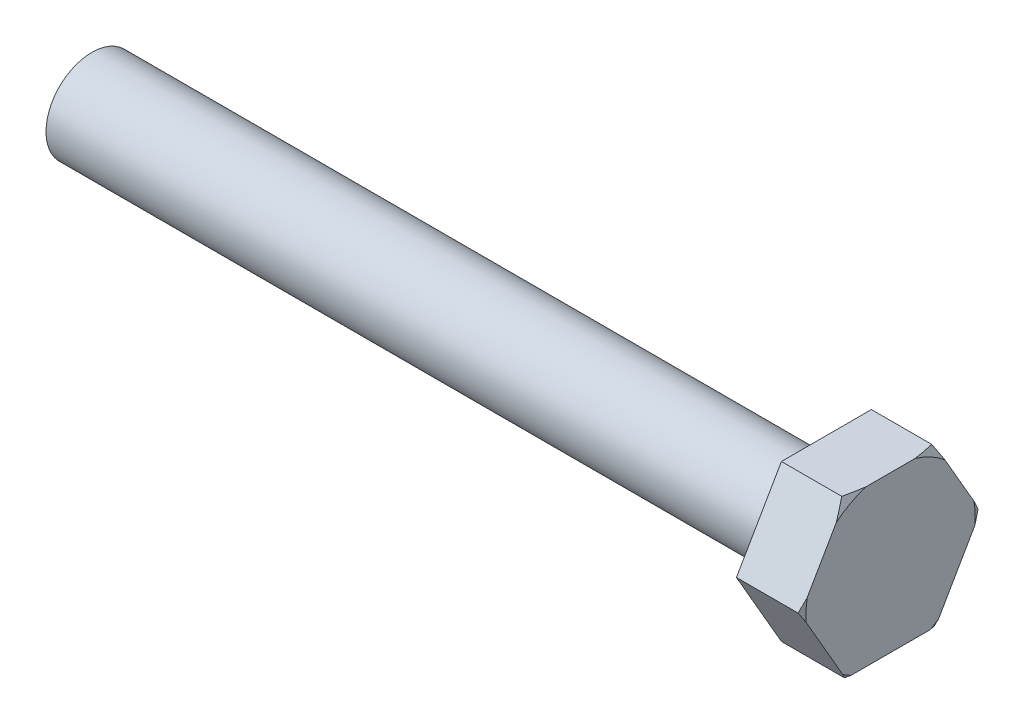
ISO-10303-21;
HEADER;
FILE_DESCRIPTION(('STEP AP214'),'2;1');
FILE_NAME('part.step','',(''),(''),'','','');
FILE_SCHEMA(('AUTOMOTIVE_DESIGN { 1 0 10303 214 1 1 1 1 }'));
ENDSEC;
DATA;
#1=APPLICATION_CONTEXT('core data for automotive mechanical design processes');
#2=APPLICATION_PROTOCOL_DEFINITION('international standard','automotive_design',2000,#1);
#3=PRODUCT_CONTEXT('',#1,'mechanical');
#4=PRODUCT('Part','Part','',(#3));
#5=PRODUCT_RELATED_PRODUCT_CATEGORY('part','',(#4));
#6=PRODUCT_DEFINITION_FORMATION('','',#4);
#7=PRODUCT_DEFINITION_CONTEXT('part definition',#1,'design');
#8=PRODUCT_DEFINITION('design','',#6,#7);
#9=PRODUCT_DEFINITION_SHAPE('','',#8);
#10=(LENGTH_UNIT() NAMED_UNIT(*) SI_UNIT(.MILLI.,.METRE.));
#11=(NAMED_UNIT(*) PLANE_ANGLE_UNIT() SI_UNIT($,.RADIAN.));
#12=(NAMED_UNIT(*) SI_UNIT($,.STERADIAN.) SOLID_ANGLE_UNIT());
#13=UNCERTAINTY_MEASURE_WITH_UNIT(LENGTH_MEASURE(1.E-05),#10,'distance_accuracy_value','');
#14=(GEOMETRIC_REPRESENTATION_CONTEXT(3) GLOBAL_UNCERTAINTY_ASSIGNED_CONTEXT((#13)) GLOBAL_UNIT_ASSIGNED_CONTEXT((#10,
#11,#12)) REPRESENTATION_CONTEXT('',''));
#15=CARTESIAN_POINT('',(0.,0.,0.));
#16=DIRECTION('',(0.,0.,1.));
#17=DIRECTION('',(1.,0.,0.));
#18=AXIS2_PLACEMENT_3D('',#15,#16,#17);
#19=CARTESIAN_POINT('',(-14.,-16.3225537589597,-9.81495457622384));
#20=DIRECTION('',(0.,-0.499999999999995,-0.866025403784441));
#21=DIRECTION('',(0.,0.866025403784442,-0.499999999999995));
#22=AXIS2_PLACEMENT_3D('',#19,#20,#21);
#23=PLANE('',#22);
#24=DIRECTION('',(1.,0.,0.));
#25=VECTOR('',#24,1.);
#26=CARTESIAN_POINT('',(-14.,0.677446241040188,-19.6299091524473));
#27=LINE('',#26,#25);
#28=CARTESIAN_POINT('',(-14.,0.677446241040188,-19.6299091524473));
#29=VERTEX_POINT('',#28);
#30=CARTESIAN_POINT('',(-0.56404183558314,0.677446241040188,-19.6299091524473));
#31=VERTEX_POINT('',#30);
#32=EDGE_CURVE('E193',#29,#31,#27,.T.);
#33=ORIENTED_EDGE('',*,*,#32,.T.);
#34=CARTESIAN_POINT('',(-0.564246750765332,0.678146241040188,-19.6303132976357));
#35=CARTESIAN_POINT('',(-0.415814321341136,0.17101445189822,-19.33752062266));
#36=CARTESIAN_POINT('',(-0.275773962525172,-0.338062329478098,-19.0436050058942));
#37=CARTESIAN_POINT('',(-0.0156550779420489,-1.36032284996286,-18.4534026192104));
#38=CARTESIAN_POINT('',(0.104411729980572,-1.87350881607,-18.1571145635341));
#39=CARTESIAN_POINT('',(0.321414317607774,-2.90451266562627,-17.5618642134573));
#40=CARTESIAN_POINT('',(0.418309259915875,-3.42233708214182,-17.2628981471891));
#41=CARTESIAN_POINT('',(0.585401824347843,-4.46113953827241,-16.6631452695072));
#42=CARTESIAN_POINT('',(0.655604664031238,-4.98211694131892,-16.3623588256166));
#43=CARTESIAN_POINT('',(0.765297727743773,-6.01450925483577,-15.7663068454984));
#44=CARTESIAN_POINT('',(0.805453354787763,-6.52587051214188,-15.4710722859395));
#45=CARTESIAN_POINT('',(0.855957657962772,-7.5497403179821,-14.8799407779226));
#46=CARTESIAN_POINT('',(0.866304709839916,-8.06224892751211,-14.5840437942484));
#47=CARTESIAN_POINT('',(0.856733594120152,-9.08641961317971,-13.9927385731821));
#48=CARTESIAN_POINT('',(0.836852552812062,-9.59808195632958,-13.6973301816303));
#49=CARTESIAN_POINT('',(0.767766869545671,-10.6198554648516,-13.1074089714344));
#50=CARTESIAN_POINT('',(0.718565204176141,-11.1299667823989,-12.8128960649318));
#51=CARTESIAN_POINT('',(0.607253631978668,-12.0311570853465,-12.2925936009338));
#52=CARTESIAN_POINT('',(0.550674528086197,-12.4227610787008,-12.066500929955));
#53=CARTESIAN_POINT('',(0.422528757833308,-13.2041375377619,-11.6153730209777));
#54=CARTESIAN_POINT('',(0.350961477348241,-13.5939099277514,-11.3903378266945));
#55=CARTESIAN_POINT('',(0.193496282128409,-14.3749707842107,-10.9393921309643));
#56=CARTESIAN_POINT('',(0.107472080145937,-14.7662399890765,-10.7134927502095));
#57=CARTESIAN_POINT('',(-0.0769549646356311,-15.5464689706405,-10.2630273376739));
#58=CARTESIAN_POINT('',(-0.175354127250165,-15.9354293980804,-10.0384609301874));
#59=CARTESIAN_POINT('',(-0.279226674625965,-16.3232537589597,-9.81455043103541));
#60=B_SPLINE_CURVE_WITH_KNOTS('',3,(#34,#35,#36,#37,#38,#39,#40,#41,#42,#43,#44,#45,#46,#47,#48,
#49,#50,#51,#52,#53,#54,#55,#56,#57,#58,#59),.UNSPECIFIED.,.F.,.F.,(4,2,2,2,2,2,2,2,2,2,2,2,4),
(0.,1.81242406030555,3.62590769047617,5.44256417720559,7.25886537561351,9.03364598192863,
10.808523293294,12.5812224520775,14.3537416795701,15.7206225639899,17.0875594658665,
18.4671250183966,19.8462812683619),.UNSPECIFIED.);
#61=CARTESIAN_POINT('',(0.,-1.44061645681595,-18.4070450836796));
#62=VERTEX_POINT('',#61);
#63=EDGE_CURVE('E212',#31,#62,#60,.T.);
#64=ORIENTED_EDGE('',*,*,#63,.T.);
#65=DIRECTION('',(0.,0.866025403784441,-0.499999999999995));
#66=VECTOR('',#65,1.);
#67=CARTESIAN_POINT('',(0.,-16.3225537589597,-9.81495457622384));
#68=LINE('',#67,#66);
#69=CARTESIAN_POINT('',(0.,-15.2206604226639,-10.4511329905525));
#70=VERTEX_POINT('',#69);
#71=EDGE_CURVE('E200',#70,#62,#68,.T.);
#72=ORIENTED_EDGE('',*,*,#71,.F.);
#73=CARTESIAN_POINT('',(-0.279039191335554,-16.3225537589597,-9.81495457622384));
#74=VERTEX_POINT('',#73);
#75=EDGE_CURVE('E201',#70,#74,#60,.T.);
#76=ORIENTED_EDGE('',*,*,#75,.T.);
#77=DIRECTION('',(1.,0.,0.));
#78=VECTOR('',#77,1.);
#79=CARTESIAN_POINT('',(-14.,-16.3225537589597,-9.81495457622384));
#80=LINE('',#79,#78);
#81=CARTESIAN_POINT('',(-14.,-16.3225537589597,-9.81495457622384));
#82=VERTEX_POINT('',#81);
#83=EDGE_CURVE('E174',#82,#74,#80,.T.);
#84=ORIENTED_EDGE('',*,*,#83,.F.);
#85=DIRECTION('',(0.,0.866025403784441,-0.499999999999995));
#86=VECTOR('',#85,1.);
#87=CARTESIAN_POINT('',(-14.,-16.3225537589597,-9.81495457622384));
#88=LINE('',#87,#86);
#89=EDGE_CURVE('E173',#82,#29,#88,.T.);
#90=ORIENTED_EDGE('',*,*,#89,.T.);
#91=EDGE_LOOP('',(#33,#64,#72,#76,#84,#90));
#92=FACE_BOUND('',#91,.T.);
#93=ADVANCED_FACE('F44',(#92),#23,.T.);
#94=CARTESIAN_POINT('',(-14.,-16.3225537589599,9.81495457622349));
#95=DIRECTION('',(0.,-1.,0.));
#96=DIRECTION('',(0.,0.,-1.));
#97=AXIS2_PLACEMENT_3D('',#94,#95,#96);
#98=PLANE('',#97);
#99=ORIENTED_EDGE('',*,*,#83,.T.);
#100=CARTESIAN_POINT('',(-0.279211877709635,-16.3225537589597,-9.81565457622384));
#101=CARTESIAN_POINT('',(-0.140002673700859,-16.3225537589597,-9.25130185368696));
#102=CARTESIAN_POINT('',(-0.00904340540102734,-16.3225537589597,-8.68480192183458));
#103=CARTESIAN_POINT('',(0.233399972988422,-16.3225537589597,-7.54733707992563));
#104=CARTESIAN_POINT('',(0.344873191400299,-16.3225537589597,-6.97636985797091));
#105=CARTESIAN_POINT('',(0.545348453218955,-16.3225537589598,-5.82962147136888));
#106=CARTESIAN_POINT('',(0.634318601582534,-16.3225537589598,-5.25383465573977));
#107=CARTESIAN_POINT('',(0.786577898185986,-16.3225537589598,-4.0989481777943));
#108=CARTESIAN_POINT('',(0.849871874587151,-16.3225537589598,-3.5198491590948));
#109=CARTESIAN_POINT('',(0.947232062083349,-16.3225537589598,-2.37231238686003));
#110=CARTESIAN_POINT('',(0.981924651598784,-16.3225537589598,-1.80392838909855));
#111=CARTESIAN_POINT('',(1.02301796483673,-16.3225537589598,-0.66609397049382));
#112=CARTESIAN_POINT('',(1.02941720895588,-16.3225537589598,-0.0966434954368893));
#113=CARTESIAN_POINT('',(1.01365346731486,-16.3225537589598,1.04123426371526));
#114=CARTESIAN_POINT('',(0.991521603235917,-16.3225537589598,1.60966198655161));
#115=CARTESIAN_POINT('',(0.919684407892073,-16.3225537589598,2.74470537933874));
#116=CARTESIAN_POINT('',(0.869981426671911,-16.3225537589599,3.31132119958903));
#117=CARTESIAN_POINT('',(0.752399366199303,-16.3225537589599,4.37439006487519));
#118=CARTESIAN_POINT('',(0.687388306509743,-16.3225537589599,4.87116600248938));
#119=CARTESIAN_POINT('',(0.539237885822729,-16.3225537589599,5.86203065708808));
#120=CARTESIAN_POINT('',(0.456097138531188,-16.3225537589599,6.35611916561438));
#121=CARTESIAN_POINT('',(0.272682697438974,-16.3225537589599,7.34642028960224));
#122=CARTESIAN_POINT('',(0.172238960121658,-16.3225537589599,7.84260110182944));
#123=CARTESIAN_POINT('',(-0.0431254972765272,-16.3225537589599,8.83160737303501));
#124=CARTESIAN_POINT('',(-0.158040260747637,-16.3225537589599,9.32443412514307));
#125=CARTESIAN_POINT('',(-0.279211877709632,-16.3225537589599,9.81565457622349));
#126=B_SPLINE_CURVE_WITH_KNOTS('',3,(#100,#101,#102,#103,#104,#105,#106,#107,#108,#109,#110,
#111,#112,#113,#114,#115,#116,#117,#118,#119,#120,#121,#122,#123,#124,#125),.UNSPECIFIED.,.F.,
.F.,(4,2,2,2,2,2,2,2,2,2,2,2,4),(0.,1.74390678288041,3.48878522266275,5.23612310377648,
6.98313226205368,8.69078097629871,10.39851899115,12.1043957837092,13.8101271969245,
15.3128072238657,16.8156021941761,18.3341095134601,19.8519938106323),.UNSPECIFIED.);
#127=CARTESIAN_POINT('',(0.,-16.3225537589597,-8.62953783664749));
#128=VERTEX_POINT('',#127);
#129=EDGE_CURVE('E210',#74,#128,#126,.T.);
#130=ORIENTED_EDGE('',*,*,#129,.T.);
#131=DIRECTION('',(0.,0.,-1.));
#132=VECTOR('',#131,1.);
#133=CARTESIAN_POINT('',(0.,-16.3225537589599,9.81495457622349));
#134=LINE('',#133,#132);
#135=CARTESIAN_POINT('',(0.,-16.3225537589599,8.62953783664714));
#136=VERTEX_POINT('',#135);
#137=EDGE_CURVE('E164',#136,#128,#134,.T.);
#138=ORIENTED_EDGE('',*,*,#137,.F.);
#139=CARTESIAN_POINT('',(-0.279039191335551,-16.3225537589599,9.81495457622349));
#140=VERTEX_POINT('',#139);
#141=EDGE_CURVE('E61',#136,#140,#126,.T.);
#142=ORIENTED_EDGE('',*,*,#141,.T.);
#143=DIRECTION('',(1.,0.,0.));
#144=VECTOR('',#143,1.);
#145=CARTESIAN_POINT('',(-14.,-16.3225537589599,9.81495457622349));
#146=LINE('',#145,#144);
#147=CARTESIAN_POINT('',(-14.,-16.3225537589599,9.81495457622349));
#148=VERTEX_POINT('',#147);
#149=EDGE_CURVE('E179',#148,#140,#146,.T.);
#150=ORIENTED_EDGE('',*,*,#149,.F.);
#151=DIRECTION('',(0.,0.,-1.));
#152=VECTOR('',#151,1.);
#153=CARTESIAN_POINT('',(-14.,-16.3225537589599,9.81495457622349));
#154=LINE('',#153,#152);
#155=EDGE_CURVE('E196',#148,#82,#154,.T.);
#156=ORIENTED_EDGE('',*,*,#155,.T.);
#157=EDGE_LOOP('',(#99,#130,#138,#142,#150,#156));
#158=FACE_BOUND('',#157,.T.);
#159=ADVANCED_FACE('F287',(#158),#98,.T.);
#160=CARTESIAN_POINT('',(-14.,0.677446241040051,19.6299091524473));
#161=DIRECTION('',(0.,-0.500000000000007,0.866025403784434));
#162=DIRECTION('',(0.,-0.866025403784435,-0.500000000000007));
#163=AXIS2_PLACEMENT_3D('',#160,#161,#162);
#164=PLANE('',#163);
#165=ORIENTED_EDGE('',*,*,#149,.T.);
#166=CARTESIAN_POINT('',(-0.27922667462596,-16.3232537589599,9.81455043103505));
#167=CARTESIAN_POINT('',(-0.149725219641444,-15.8397595856021,10.0936959221748));
#168=CARTESIAN_POINT('',(-0.0287306393909909,-15.3544646092627,10.3738811074007));
#169=CARTESIAN_POINT('',(0.193487404824988,-14.380252646897,10.9363426461203));
#170=CARTESIAN_POINT('',(0.294700925707737,-13.8913339668895,11.2186199776345));
#171=CARTESIAN_POINT('',(0.474537848944333,-12.9099363426834,11.785230160152));
#172=CARTESIAN_POINT('',(0.553142617071182,-12.4174548026946,12.0695645098355));
#173=CARTESIAN_POINT('',(0.685027604467599,-11.4300148625988,12.6396632250584));
#174=CARTESIAN_POINT('',(0.738312227776485,-10.9350569083704,12.9254273331697));
#175=CARTESIAN_POINT('',(0.816730856158126,-9.95394196041103,13.49187431248));
#176=CARTESIAN_POINT('',(0.842434859028281,-9.46781950658883,13.7725372420534));
#177=CARTESIAN_POINT('',(0.866661800786284,-8.49503379124964,14.3341753366683));
#178=CARTESIAN_POINT('',(0.86518329219021,-8.00837050231272,14.6151505175407));
#179=CARTESIAN_POINT('',(0.835114003228707,-7.03609828281367,15.1764921451941));
#180=CARTESIAN_POINT('',(0.806546432151513,-6.55048880631568,15.4568589071712));
#181=CARTESIAN_POINT('',(0.723446957006737,-5.58099311973631,16.016597502796));
#182=CARTESIAN_POINT('',(0.668916993524128,-5.0971067835801,16.295969409233));
#183=CARTESIAN_POINT('',(0.541184608218332,-4.17055176843992,16.8309161966432));
#184=CARTESIAN_POINT('',(0.46983005215454,-3.72768927301,17.0866029775937));
#185=CARTESIAN_POINT('',(0.308712980849957,-2.84448331933253,17.5965221726992));
#186=CARTESIAN_POINT('',(0.218949836004044,-2.40413994777294,17.850754536805));
#187=CARTESIAN_POINT('',(0.0220774663271806,-1.5217109604841,18.360225150157));
#188=CARTESIAN_POINT('',(-0.0852002352457143,-1.07965380210706,18.6154469695432));
#189=CARTESIAN_POINT('',(-0.314317642672809,-0.1985397374262,19.1241584119735));
#190=CARTESIAN_POINT('',(-0.436152022915879,0.240518204379259,19.3776486328647));
#191=CARTESIAN_POINT('',(-0.564246750765328,0.67814624104005,19.6303132976357));
#192=B_SPLINE_CURVE_WITH_KNOTS('',3,(#166,#167,#168,#169,#170,#171,#172,#173,#174,#175,#176,
#177,#178,#179,#180,#181,#182,#183,#184,#185,#186,#187,#188,#189,#190,#191),.UNSPECIFIED.,.F.,
.F.,(4,2,2,2,2,2,2,2,2,2,2,2,4),(0.,1.71942964795087,3.43972136838168,5.16142692376842,
6.88283290595116,8.56793432796852,10.2531254828379,11.9368741078485,13.6204968991383,
15.1691179690331,16.7177920132448,18.2823509694753,19.8463392691165),.UNSPECIFIED.);
#193=CARTESIAN_POINT('',(0.,-15.2206604226641,10.4511329905521));
#194=VERTEX_POINT('',#193);
#195=EDGE_CURVE('E277',#140,#194,#192,.T.);
#196=ORIENTED_EDGE('',*,*,#195,.T.);
#197=DIRECTION('',(0.,-0.866025403784434,-0.500000000000007));
#198=VECTOR('',#197,1.);
#199=CARTESIAN_POINT('',(0.,0.677446241040051,19.6299091524473));
#200=LINE('',#199,#198);
#201=CARTESIAN_POINT('',(0.,-1.44061645681603,18.4070450836795));
#202=VERTEX_POINT('',#201);
#203=EDGE_CURVE('E158',#202,#194,#200,.T.);
#204=ORIENTED_EDGE('',*,*,#203,.F.);
#205=CARTESIAN_POINT('',(-0.564041835583136,0.67744624104005,19.6299091524473));
#206=VERTEX_POINT('',#205);
#207=EDGE_CURVE('E69',#202,#206,#192,.T.);
#208=ORIENTED_EDGE('',*,*,#207,.T.);
#209=DIRECTION('',(1.,0.,0.));
#210=VECTOR('',#209,1.);
#211=CARTESIAN_POINT('',(-14.,0.677446241040051,19.6299091524473));
#212=LINE('',#211,#210);
#213=CARTESIAN_POINT('',(-14.,0.677446241040051,19.6299091524473));
#214=VERTEX_POINT('',#213);
#215=EDGE_CURVE('E149',#214,#206,#212,.T.);
#216=ORIENTED_EDGE('',*,*,#215,.F.);
#217=DIRECTION('',(0.,-0.866025403784434,-0.500000000000007));
#218=VECTOR('',#217,1.);
#219=CARTESIAN_POINT('',(-14.,0.677446241040051,19.6299091524473));
#220=LINE('',#219,#218);
#221=EDGE_CURVE('E330',#214,#148,#220,.T.);
#222=ORIENTED_EDGE('',*,*,#221,.T.);
#223=EDGE_LOOP('',(#165,#196,#204,#208,#216,#222));
#224=FACE_BOUND('',#223,.T.);
#225=ADVANCED_FACE('F284',(#224),#164,.T.);
#226=CARTESIAN_POINT('',(-14.,17.6774462410402,9.81495457622372));
#227=DIRECTION('',(0.,0.499999999999995,0.866025403784441));
#228=DIRECTION('',(0.,-0.866025403784442,0.499999999999995));
#229=AXIS2_PLACEMENT_3D('',#226,#227,#228);
#230=PLANE('',#229);
#231=ORIENTED_EDGE('',*,*,#215,.T.);
#232=CARTESIAN_POINT('',(-0.564223636148396,0.676746241040051,19.6303132976357));
#233=CARTESIAN_POINT('',(-0.435231949450683,1.17335723055571,19.3435948091563));
#234=CARTESIAN_POINT('',(-0.315146944354757,1.67179556332786,19.0558213035559));
#235=CARTESIAN_POINT('',(-0.0955310527984705,2.6722887027642,18.47818632018));
#236=CARTESIAN_POINT('',(0.0039900221717416,3.17434511801504,18.1883239136865));
#237=CARTESIAN_POINT('',(0.179662265277993,4.18186741859714,17.6066306422309));
#238=CARTESIAN_POINT('',(0.255799265206282,4.68733518205602,17.3147986929313));
#239=CARTESIAN_POINT('',(0.382092416355361,5.70063869153272,16.7297676389641));
#240=CARTESIAN_POINT('',(0.43225292996734,6.20847402548685,16.4365687722017));
#241=CARTESIAN_POINT('',(0.50401315648473,7.21540008799938,15.855219738956));
#242=CARTESIAN_POINT('',(0.52616799214128,7.71446083268068,15.5670868836723));
#243=CARTESIAN_POINT('',(0.542908027424486,8.71296203240184,14.9906019472271));
#244=CARTESIAN_POINT('',(0.537491686428164,9.21240250710114,14.7022498547153));
#245=CARTESIAN_POINT('',(0.499312513482771,10.210100860343,14.1262284419011));
#246=CARTESIAN_POINT('',(0.466570850313454,10.7083593550024,13.8385587658834));
#247=CARTESIAN_POINT('',(0.375000683312631,11.70301903785,13.2642917302394));
#248=CARTESIAN_POINT('',(0.316174247350844,12.1994203701194,12.9776942874275));
#249=CARTESIAN_POINT('',(0.185520477880032,13.1123497647944,12.4506142556608));
#250=CARTESIAN_POINT('',(0.117153755437129,13.5292555509076,12.2099135878217));
#251=CARTESIAN_POINT('',(-0.0352278248956144,14.3608944781135,11.7297666293308));
#252=CARTESIAN_POINT('',(-0.119242179156803,14.7756276886904,11.4903202985623));
#253=CARTESIAN_POINT('',(-0.302149939403626,15.6064667132415,11.0106351640845));
#254=CARTESIAN_POINT('',(-0.401170166703252,16.0225514169485,10.7704085483935));
#255=CARTESIAN_POINT('',(-0.611897206829773,16.8522134990667,10.2914029219462));
#256=CARTESIAN_POINT('',(-0.723601193671467,17.2657914144522,10.0526236011675));
#257=CARTESIAN_POINT('',(-0.840855292969141,17.6781462410402,9.81455043103529));
#258=B_SPLINE_CURVE_WITH_KNOTS('',3,(#232,#233,#234,#235,#236,#237,#238,#239,#240,#241,#242,
#243,#244,#245,#246,#247,#248,#249,#250,#251,#252,#253,#254,#255,#256,#257),.UNSPECIFIED.,.F.,
.F.,(4,2,2,2,2,2,2,2,2,2,2,2,4),(0.,1.76338250734104,3.52760442923156,5.29289317867205,
7.05788537609599,8.78731371801048,10.5168386980309,12.2450250667529,13.9730744580296,
15.4315001488114,16.8898789073749,18.3613519853359,19.8324978549745),.UNSPECIFIED.);
#259=CARTESIAN_POINT('',(0.,3.17413419656951,18.1884456892399));
#260=VERTEX_POINT('',#259);
#261=EDGE_CURVE('E135',#206,#260,#258,.T.);
#262=ORIENTED_EDGE('',*,*,#261,.T.);
#263=DIRECTION('',(0.,-0.866025403784441,0.499999999999995));
#264=VECTOR('',#263,1.);
#265=CARTESIAN_POINT('',(0.,17.6774462410402,9.81495457622372));
#266=LINE('',#265,#264);
#267=CARTESIAN_POINT('',(0.,14.1645889239504,11.8431036938702));
#268=VERTEX_POINT('',#267);
#269=EDGE_CURVE('E147',#268,#260,#266,.T.);
#270=ORIENTED_EDGE('',*,*,#269,.F.);
#271=CARTESIAN_POINT('',(-0.840656233791189,17.6774462410402,9.81495457622372));
#272=VERTEX_POINT('',#271);
#273=EDGE_CURVE('E151',#268,#272,#258,.T.);
#274=ORIENTED_EDGE('',*,*,#273,.T.);
#275=DIRECTION('',(1.,0.,0.));
#276=VECTOR('',#275,1.);
#277=CARTESIAN_POINT('',(-14.,17.6774462410402,9.81495457622372));
#278=LINE('',#277,#276);
#279=CARTESIAN_POINT('',(-14.,17.6774462410402,9.81495457622372));
#280=VERTEX_POINT('',#279);
#281=EDGE_CURVE('E185',#280,#272,#278,.T.);
#282=ORIENTED_EDGE('',*,*,#281,.F.);
#283=DIRECTION('',(0.,-0.866025403784441,0.499999999999995));
#284=VECTOR('',#283,1.);
#285=CARTESIAN_POINT('',(-14.,17.6774462410402,9.81495457622372));
#286=LINE('',#285,#284);
#287=EDGE_CURVE('E324',#280,#214,#286,.T.);
#288=ORIENTED_EDGE('',*,*,#287,.T.);
#289=EDGE_LOOP('',(#231,#262,#270,#274,#282,#288));
#290=FACE_BOUND('',#289,.T.);
#291=ADVANCED_FACE('F145',(#290),#230,.T.);
#292=CARTESIAN_POINT('',(-14.,17.6774462410402,-9.81495457622361));
#293=DIRECTION('',(0.,1.,0.));
#294=DIRECTION('',(0.,0.,1.));
#295=AXIS2_PLACEMENT_3D('',#292,#293,#294);
#296=PLANE('',#295);
#297=ORIENTED_EDGE('',*,*,#281,.T.);
#298=CARTESIAN_POINT('',(-0.840818900519864,17.6774462410402,9.81565457622373));
#299=CARTESIAN_POINT('',(-0.703103225715071,17.6774462410402,9.22304545462808));
#300=CARTESIAN_POINT('',(-0.574403204146888,17.6774462410402,8.62822853092602));
#301=CARTESIAN_POINT('',(-0.33796467333084,17.6774462410402,7.43414869134409));
#302=CARTESIAN_POINT('',(-0.230236761180974,17.6774462410402,6.83488368581294));
#303=CARTESIAN_POINT('',(-0.0387297242044264,17.6774462410402,5.63192378039635));
#304=CARTESIAN_POINT('',(0.0450273452524497,17.6774462410402,5.02822532169661));
#305=CARTESIAN_POINT('',(0.185666717358526,17.6774462410402,3.81778026701393));
#306=CARTESIAN_POINT('',(0.24255373889905,17.6774462410402,3.21103422517423));
#307=CARTESIAN_POINT('',(0.326459931223932,17.6774462410402,2.00794587158529));
#308=CARTESIAN_POINT('',(0.354066986917908,17.6774462410402,1.41164500618769));
#309=CARTESIAN_POINT('',(0.380374169284458,17.6774462410402,0.218361825237779));
#310=CARTESIAN_POINT('',(0.379072614292554,17.6774462410402,-0.378620527937925));
#311=CARTESIAN_POINT('',(0.347625733681605,17.6774462410402,-1.57127423087683));
#312=CARTESIAN_POINT('',(0.317506403832254,17.6774462410402,-2.16694627727602));
#313=CARTESIAN_POINT('',(0.229638656324759,17.6774462410402,-3.35617803910355));
#314=CARTESIAN_POINT('',(0.171892801822158,17.6774462410402,-3.94973794534793));
#315=CARTESIAN_POINT('',(0.0487499466934539,17.6774462410402,-4.98355379289787));
#316=CARTESIAN_POINT('',(-0.0109890819216378,17.6774462410402,-5.42449868421759));
#317=CARTESIAN_POINT('',(-0.143616388494417,17.6774462410402,-6.30438264842339));
#318=CARTESIAN_POINT('',(-0.216504049484507,17.6774462410402,-6.74332181443281));
#319=CARTESIAN_POINT('',(-0.374909448226648,17.6774462410402,-7.62254100396795));
#320=CARTESIAN_POINT('',(-0.460523961518391,17.6774462410402,-8.06280346353673));
#321=CARTESIAN_POINT('',(-0.642733649507057,17.6774462410402,-8.94098515790852));
#322=CARTESIAN_POINT('',(-0.739327148199752,17.6774462410402,-9.37890473970653));
#323=CARTESIAN_POINT('',(-0.840818900519864,17.6774462410402,-9.81565457622361));
#324=B_SPLINE_CURVE_WITH_KNOTS('',3,(#298,#299,#300,#301,#302,#303,#304,#305,#306,#307,#308,
#309,#310,#311,#312,#313,#314,#315,#316,#317,#318,#319,#320,#321,#322,#323),.UNSPECIFIED.,.F.,
.F.,(4,2,2,2,2,2,2,2,2,2,2,2,4),(0.,1.82529535458146,3.65151064105271,5.47940085015062,
7.30696992750797,9.09710697413838,10.8873481564465,12.6759759295523,14.464437788109,
15.7991600989992,17.1338197975734,18.4792033225482,19.8243817422607),.UNSPECIFIED.);
#325=CARTESIAN_POINT('',(0.,17.6774462410402,5.32940699172012));
#326=VERTEX_POINT('',#325);
#327=EDGE_CURVE('E343',#272,#326,#324,.T.);
#328=ORIENTED_EDGE('',*,*,#327,.T.);
#329=DIRECTION('',(0.,0.,1.));
#330=VECTOR('',#329,1.);
#331=CARTESIAN_POINT('',(0.,17.6774462410402,-9.81495457622361));
#332=LINE('',#331,#330);
#333=CARTESIAN_POINT('',(0.,17.6774462410402,-5.32940699172001));
#334=VERTEX_POINT('',#333);
#335=EDGE_CURVE('E159',#334,#326,#332,.T.);
#336=ORIENTED_EDGE('',*,*,#335,.F.);
#337=CARTESIAN_POINT('',(-0.840656233791188,17.6774462410402,-9.81495457622361));
#338=VERTEX_POINT('',#337);
#339=EDGE_CURVE('E234',#334,#338,#324,.T.);
#340=ORIENTED_EDGE('',*,*,#339,.T.);
#341=DIRECTION('',(1.,0.,0.));
#342=VECTOR('',#341,1.);
#343=CARTESIAN_POINT('',(-14.,17.6774462410402,-9.81495457622361));
#344=LINE('',#343,#342);
#345=CARTESIAN_POINT('',(-14.,17.6774462410402,-9.81495457622361));
#346=VERTEX_POINT('',#345);
#347=EDGE_CURVE('E189',#346,#338,#344,.T.);
#348=ORIENTED_EDGE('',*,*,#347,.F.);
#349=DIRECTION('',(0.,0.,1.));
#350=VECTOR('',#349,1.);
#351=CARTESIAN_POINT('',(-14.,17.6774462410402,-9.81495457622361));
#352=LINE('',#351,#350);
#353=EDGE_CURVE('E318',#346,#280,#352,.T.);
#354=ORIENTED_EDGE('',*,*,#353,.T.);
#355=EDGE_LOOP('',(#297,#328,#336,#340,#348,#354));
#356=FACE_BOUND('',#355,.T.);
#357=ADVANCED_FACE('F293',(#356),#296,.T.);
#358=CARTESIAN_POINT('',(-14.,0.677446241040188,-19.6299091524473));
#359=DIRECTION('',(0.,0.500000000000001,-0.866025403784438));
#360=DIRECTION('',(0.,0.866025403784438,0.500000000000001));
#361=AXIS2_PLACEMENT_3D('',#358,#359,#360);
#362=PLANE('',#361);
#363=ORIENTED_EDGE('',*,*,#347,.T.);
#364=CARTESIAN_POINT('',(-0.84085529296914,17.6781462410402,-9.81455043103517));
#365=CARTESIAN_POINT('',(-0.693439378344825,17.1597041730331,-10.1138730985583));
#366=CARTESIAN_POINT('',(-0.554781592362818,16.639291570017,-10.4143334549993));
#367=CARTESIAN_POINT('',(-0.298129688896622,15.5943717566839,-11.0176181905088));
#368=CARTESIAN_POINT('',(-0.180147114408438,15.0698624287635,-11.3204437921761));
#369=CARTESIAN_POINT('',(0.0319918378628486,14.0163976056856,-11.9286619913619));
#370=CARTESIAN_POINT('',(0.126112859847229,13.4874366989083,-12.2340577132806));
#371=CARTESIAN_POINT('',(0.287126942149763,12.4264834096793,-12.8465993804146));
#372=CARTESIAN_POINT('',(0.354025146998752,11.8944916192863,-13.1537449838047));
#373=CARTESIAN_POINT('',(0.456890965505022,10.8398999167817,-13.7626137871308));
#374=CARTESIAN_POINT('',(0.493499785642692,10.3173474522181,-14.0643095932123));
#375=CARTESIAN_POINT('',(0.536696549497639,9.27126861293111,-14.6682634926682));
#376=CARTESIAN_POINT('',(0.543282759751277,8.74774218371818,-14.9705216175022));
#377=CARTESIAN_POINT('',(0.526157252562663,7.7016557401593,-15.5744799072865));
#378=CARTESIAN_POINT('',(0.50247946412798,7.17909530016472,-15.8761803179853));
#379=CARTESIAN_POINT('',(0.425881325740941,6.13565001455027,-16.4786137345194));
#380=CARTESIAN_POINT('',(0.372964026589227,5.61476499982145,-16.7793468379899));
#381=CARTESIAN_POINT('',(0.259117326186347,4.72523920887741,-17.2929147928426));
#382=CARTESIAN_POINT('',(0.204880063595388,4.35593903226313,-17.5061303492226));
#383=CARTESIAN_POINT('',(0.0836109740521872,3.61892380240053,-17.9316462905806));
#384=CARTESIAN_POINT('',(0.0165793337951115,3.25120872610253,-18.1439466888664));
#385=CARTESIAN_POINT('',(-0.129805441627719,2.51456396045317,-18.5692487426112));
#386=CARTESIAN_POINT('',(-0.209254128993139,2.14564862022911,-18.7822421135977));
#387=CARTESIAN_POINT('',(-0.378932853765329,1.40974863219083,-19.2071141697883));
#388=CARTESIAN_POINT('',(-0.469160906891923,1.04276364198085,-19.4189930526745));
#389=CARTESIAN_POINT('',(-0.564223636148397,0.676746241040187,-19.6303132976357));
#390=B_SPLINE_CURVE_WITH_KNOTS('',3,(#364,#365,#366,#367,#368,#369,#370,#371,#372,#373,#374,
#375,#376,#377,#378,#379,#380,#381,#382,#383,#384,#385,#386,#387,#388,#389),.UNSPECIFIED.,.F.,
.F.,(4,2,2,2,2,2,2,2,2,2,2,2,4),(0.,1.84969276490433,3.70041494809295,5.55386353757129,
7.40696170201989,9.21974749803677,11.0326379604525,12.8434977706189,14.6541686744319,
15.9435789739573,17.2329704598854,18.5328227772837,19.8324361837419),.UNSPECIFIED.);
#391=CARTESIAN_POINT('',(0.,14.1645889239505,-11.8431036938701));
#392=VERTEX_POINT('',#391);
#393=EDGE_CURVE('E228',#338,#392,#390,.T.);
#394=ORIENTED_EDGE('',*,*,#393,.T.);
#395=DIRECTION('',(0.,0.866025403784438,0.500000000000001));
#396=VECTOR('',#395,1.);
#397=CARTESIAN_POINT('',(0.,0.677446241040188,-19.6299091524473));
#398=LINE('',#397,#396);
#399=CARTESIAN_POINT('',(0.,3.17413419656966,-18.1884456892399));
#400=VERTEX_POINT('',#399);
#401=EDGE_CURVE('E166',#400,#392,#398,.T.);
#402=ORIENTED_EDGE('',*,*,#401,.F.);
#403=EDGE_CURVE('E229',#400,#31,#390,.T.);
#404=ORIENTED_EDGE('',*,*,#403,.T.);
#405=ORIENTED_EDGE('',*,*,#32,.F.);
#406=DIRECTION('',(0.,0.866025403784438,0.500000000000001));
#407=VECTOR('',#406,1.);
#408=CARTESIAN_POINT('',(-14.,0.677446241040188,-19.6299091524473));
#409=LINE('',#408,#407);
#410=EDGE_CURVE('E310',#29,#346,#409,.T.);
#411=ORIENTED_EDGE('',*,*,#410,.T.);
#412=EDGE_LOOP('',(#363,#394,#402,#404,#405,#411));
#413=FACE_BOUND('',#412,.T.);
#414=ADVANCED_FACE('F244',(#413),#362,.T.);
#415=CARTESIAN_POINT('',(0.,0.,0.));
#416=DIRECTION('',(1.,0.,0.));
#417=DIRECTION('',(0.,0.,-1.));
#418=AXIS2_PLACEMENT_3D('',#415,#416,#417);
#419=PLANE('',#418);
#420=ORIENTED_EDGE('',*,*,#401,.T.);
#421=CARTESIAN_POINT('',(0.,0.,0.));
#422=DIRECTION('',(1.,0.,0.));
#423=DIRECTION('',(0.,0.,-1.));
#424=AXIS2_PLACEMENT_3D('',#421,#422,#423);
#425=CIRCLE('',#424,18.4633335150579);
#426=EDGE_CURVE('E11',#392,#334,#425,.T.);
#427=ORIENTED_EDGE('',*,*,#426,.T.);
#428=ORIENTED_EDGE('',*,*,#335,.T.);
#429=EDGE_CURVE('E54',#326,#268,#425,.T.);
#430=ORIENTED_EDGE('',*,*,#429,.T.);
#431=ORIENTED_EDGE('',*,*,#269,.T.);
#432=EDGE_CURVE('E132',#260,#202,#425,.T.);
#433=ORIENTED_EDGE('',*,*,#432,.T.);
#434=ORIENTED_EDGE('',*,*,#203,.T.);
#435=EDGE_CURVE('E141',#194,#136,#425,.T.);
#436=ORIENTED_EDGE('',*,*,#435,.T.);
#437=ORIENTED_EDGE('',*,*,#137,.T.);
#438=EDGE_CURVE('E358',#128,#70,#425,.T.);
#439=ORIENTED_EDGE('',*,*,#438,.T.);
#440=ORIENTED_EDGE('',*,*,#71,.T.);
#441=EDGE_CURVE('E48',#62,#400,#425,.T.);
#442=ORIENTED_EDGE('',*,*,#441,.T.);
#443=EDGE_LOOP('',(#420,#427,#428,#430,#431,#433,#434,#436,#437,#439,#440,#442));
#444=FACE_BOUND('',#443,.T.);
#445=ADVANCED_FACE('F155',(#444),#419,.T.);
#446=CARTESIAN_POINT('',(-14.,0.,0.));
#447=DIRECTION('',(1.,0.,0.));
#448=DIRECTION('',(0.,0.,-1.));
#449=AXIS2_PLACEMENT_3D('',#446,#447,#448);
#450=PLANE('',#449);
#451=CARTESIAN_POINT('',(-14.,0.179585486469944,0.237076549795344));
#452=DIRECTION('',(-1.,0.,0.));
#453=DIRECTION('',(0.,0.,1.));
#454=AXIS2_PLACEMENT_3D('',#451,#452,#453);
#455=CIRCLE('',#454,10.);
#456=CARTESIAN_POINT('',(-14.,0.179585486469944,10.2370765497953));
#457=VERTEX_POINT('',#456);
#458=EDGE_CURVE('E178',#457,#457,#455,.T.);
#459=ORIENTED_EDGE('',*,*,#458,.F.);
#460=EDGE_LOOP('',(#459));
#461=FACE_BOUND('',#460,.T.);
#462=ORIENTED_EDGE('',*,*,#89,.F.);
#463=ORIENTED_EDGE('',*,*,#155,.F.);
#464=ORIENTED_EDGE('',*,*,#221,.F.);
#465=ORIENTED_EDGE('',*,*,#287,.F.);
#466=ORIENTED_EDGE('',*,*,#353,.F.);
#467=ORIENTED_EDGE('',*,*,#410,.F.);
#468=EDGE_LOOP('',(#462,#463,#464,#465,#466,#467));
#469=FACE_BOUND('',#468,.T.);
#470=ADVANCED_FACE('F313',(#461,#469),#450,.F.);
#471=CARTESIAN_POINT('',(-174.,0.179585486469944,0.237076549795344));
#472=DIRECTION('',(1.,0.,0.));
#473=DIRECTION('',(0.,0.,-1.));
#474=AXIS2_PLACEMENT_3D('',#471,#472,#473);
#475=CYLINDRICAL_SURFACE('',#474,10.);
#476=CARTESIAN_POINT('',(-174.,0.179585486469944,0.237076549795344));
#477=DIRECTION('',(-1.,0.,0.));
#478=DIRECTION('',(0.,0.,1.));
#479=AXIS2_PLACEMENT_3D('',#476,#477,#478);
#480=CIRCLE('',#479,10.);
#481=CARTESIAN_POINT('',(-174.,0.179585486469944,10.2370765497953));
#482=VERTEX_POINT('',#481);
#483=EDGE_CURVE('E197',#482,#482,#480,.T.);
#484=ORIENTED_EDGE('',*,*,#483,.F.);
#485=EDGE_LOOP('',(#484));
#486=FACE_BOUND('',#485,.T.);
#487=ORIENTED_EDGE('',*,*,#458,.T.);
#488=EDGE_LOOP('',(#487));
#489=FACE_BOUND('',#488,.T.);
#490=ADVANCED_FACE('F254',(#486,#489),#475,.T.);
#491=CARTESIAN_POINT('',(-158.833333333333,0.179585486469944,0.237076549795344));
#492=DIRECTION('',(0.,0.,1.));
#493=DIRECTION('',(1.,0.,0.));
#494=AXIS2_PLACEMENT_3D('',#491,#492,#493);
#495=SPHERICAL_SURFACE('',#494,18.1666666666667);
#496=CARTESIAN_POINT('',(-158.833333333333,0.179585486469944,0.237076549795344));
#497=DIRECTION('',(-1.,0.,0.));
#498=DIRECTION('',(0.,0.,1.));
#499=AXIS2_PLACEMENT_3D('',#496,#497,#498);
#500=SPHERICAL_SURFACE('',#499,18.1666666666667);
#501=ORIENTED_EDGE('',*,*,#483,.T.);
#502=EDGE_LOOP('',(#501));
#503=FACE_BOUND('',#502,.T.);
#504=ADVANCED_FACE('F46',(#503),#500,.T.);
#505=CARTESIAN_POINT('',(-1.6326939558553,0.,0.));
#506=DIRECTION('',(-1.,0.,0.));
#507=DIRECTION('',(0.,0.,1.));
#508=AXIS2_PLACEMENT_3D('',#505,#506,#507);
#509=CONICAL_SURFACE('',#508,21.8739686969798,1.12432799317503);
#510=ORIENTED_EDGE('',*,*,#403,.F.);
#511=ORIENTED_EDGE('',*,*,#441,.F.);
#512=ORIENTED_EDGE('',*,*,#63,.F.);
#513=EDGE_LOOP('',(#510,#511,#512));
#514=FACE_BOUND('',#513,.T.);
#515=ADVANCED_FACE('F247',(#514),#509,.T.);
#516=ORIENTED_EDGE('',*,*,#438,.F.);
#517=ORIENTED_EDGE('',*,*,#129,.F.);
#518=ORIENTED_EDGE('',*,*,#75,.F.);
#519=EDGE_LOOP('',(#516,#517,#518));
#520=FACE_BOUND('',#519,.T.);
#521=ADVANCED_FACE('F251',(#520),#509,.T.);
#522=ORIENTED_EDGE('',*,*,#435,.F.);
#523=ORIENTED_EDGE('',*,*,#195,.F.);
#524=ORIENTED_EDGE('',*,*,#141,.F.);
#525=EDGE_LOOP('',(#522,#523,#524));
#526=FACE_BOUND('',#525,.T.);
#527=ADVANCED_FACE('F462',(#526),#509,.T.);
#528=ORIENTED_EDGE('',*,*,#432,.F.);
#529=ORIENTED_EDGE('',*,*,#261,.F.);
#530=ORIENTED_EDGE('',*,*,#207,.F.);
#531=EDGE_LOOP('',(#528,#529,#530));
#532=FACE_BOUND('',#531,.T.);
#533=ADVANCED_FACE('F134',(#532),#509,.T.);
#534=ORIENTED_EDGE('',*,*,#429,.F.);
#535=ORIENTED_EDGE('',*,*,#327,.F.);
#536=ORIENTED_EDGE('',*,*,#273,.F.);
#537=EDGE_LOOP('',(#534,#535,#536));
#538=FACE_BOUND('',#537,.T.);
#539=ADVANCED_FACE('F350',(#538),#509,.T.);
#540=ORIENTED_EDGE('',*,*,#426,.F.);
#541=ORIENTED_EDGE('',*,*,#393,.F.);
#542=ORIENTED_EDGE('',*,*,#339,.F.);
#543=EDGE_LOOP('',(#540,#541,#542));
#544=FACE_BOUND('',#543,.T.);
#545=ADVANCED_FACE('F253',(#544),#509,.T.);
#546=CLOSED_SHELL('',(#93,#159,#225,#291,#357,#414,#445,#470,#490,#504,#515,#521,#527,#533,#539,#545));
#547=MANIFOLD_SOLID_BREP('B2',#546);
#548=ADVANCED_BREP_SHAPE_REPRESENTATION('',(#18,#547),#14);
#549=SHAPE_DEFINITION_REPRESENTATION(#9,#548);
ENDSEC;
END-ISO-10303-21;
